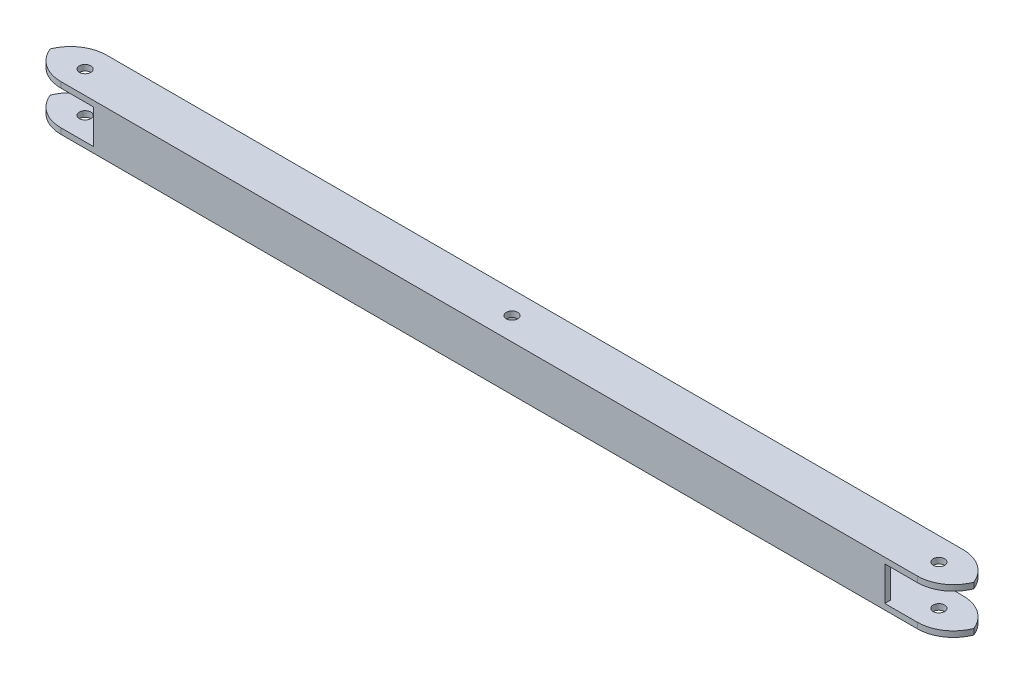
ISO-10303-21;
HEADER;
FILE_DESCRIPTION(('STEP AP214'),'2;1');
FILE_NAME('part.step','',(''),(''),'','','');
FILE_SCHEMA(('AUTOMOTIVE_DESIGN { 1 0 10303 214 1 1 1 1 }'));
ENDSEC;
DATA;
#1=APPLICATION_CONTEXT('core data for automotive mechanical design processes');
#2=APPLICATION_PROTOCOL_DEFINITION('international standard','automotive_design',2000,#1);
#3=PRODUCT_CONTEXT('',#1,'mechanical');
#4=PRODUCT('Part','Part','',(#3));
#5=PRODUCT_RELATED_PRODUCT_CATEGORY('part','',(#4));
#6=PRODUCT_DEFINITION_FORMATION('','',#4);
#7=PRODUCT_DEFINITION_CONTEXT('part definition',#1,'design');
#8=PRODUCT_DEFINITION('design','',#6,#7);
#9=PRODUCT_DEFINITION_SHAPE('','',#8);
#10=(LENGTH_UNIT() NAMED_UNIT(*) SI_UNIT(.MILLI.,.METRE.));
#11=(NAMED_UNIT(*) PLANE_ANGLE_UNIT() SI_UNIT($,.RADIAN.));
#12=(NAMED_UNIT(*) SI_UNIT($,.STERADIAN.) SOLID_ANGLE_UNIT());
#13=UNCERTAINTY_MEASURE_WITH_UNIT(LENGTH_MEASURE(1.E-05),#10,'distance_accuracy_value','');
#14=(GEOMETRIC_REPRESENTATION_CONTEXT(3) GLOBAL_UNCERTAINTY_ASSIGNED_CONTEXT((#13)) GLOBAL_UNIT_ASSIGNED_CONTEXT((#10,
#11,#12)) REPRESENTATION_CONTEXT('',''));
#15=CARTESIAN_POINT('',(0.,0.,0.));
#16=DIRECTION('',(0.,0.,1.));
#17=DIRECTION('',(1.,0.,0.));
#18=AXIS2_PLACEMENT_3D('',#15,#16,#17);
#19=CARTESIAN_POINT('',(515.5,25.4,25.4000000000002));
#20=DIRECTION('',(0.,0.,-1.));
#21=DIRECTION('',(-1.,0.,0.));
#22=AXIS2_PLACEMENT_3D('',#19,#20,#21);
#23=PLANE('',#22);
#24=DIRECTION('',(1.,0.,0.));
#25=VECTOR('',#24,1.);
#26=CARTESIAN_POINT('',(515.5,0.,25.4000000000002));
#27=LINE('',#26,#25);
#28=CARTESIAN_POINT('',(20.,0.,25.4000000000003));
#29=VERTEX_POINT('',#28);
#30=CARTESIAN_POINT('',(495.5,0.,25.4000000000002));
#31=VERTEX_POINT('',#30);
#32=EDGE_CURVE('E286',#29,#31,#27,.T.);
#33=ORIENTED_EDGE('',*,*,#32,.T.);
#34=DIRECTION('',(0.,-1.,0.));
#35=VECTOR('',#34,1.);
#36=CARTESIAN_POINT('',(495.5,25.4,25.4000000000002));
#37=LINE('',#36,#35);
#38=CARTESIAN_POINT('',(495.5,3.175,25.4000000000003));
#39=VERTEX_POINT('',#38);
#40=EDGE_CURVE('E11',#31,#39,#37,.F.);
#41=ORIENTED_EDGE('',*,*,#40,.T.);
#42=DIRECTION('',(1.,0.,0.));
#43=VECTOR('',#42,1.);
#44=CARTESIAN_POINT('',(477.4,3.175,25.4000000000003));
#45=LINE('',#44,#43);
#46=CARTESIAN_POINT('',(477.4,3.175,25.4000000000003));
#47=VERTEX_POINT('',#46);
#48=EDGE_CURVE('E190',#47,#39,#45,.T.);
#49=ORIENTED_EDGE('',*,*,#48,.F.);
#50=DIRECTION('',(0.,1.,0.));
#51=VECTOR('',#50,1.);
#52=CARTESIAN_POINT('',(477.4,22.225,25.4000000000003));
#53=LINE('',#52,#51);
#54=CARTESIAN_POINT('',(477.4,22.225,25.4000000000003));
#55=VERTEX_POINT('',#54);
#56=EDGE_CURVE('E196',#47,#55,#53,.T.);
#57=ORIENTED_EDGE('',*,*,#56,.T.);
#58=DIRECTION('',(1.,0.,0.));
#59=VECTOR('',#58,1.);
#60=CARTESIAN_POINT('',(477.4,22.225,25.4000000000003));
#61=LINE('',#60,#59);
#62=CARTESIAN_POINT('',(495.5,22.225,25.4000000000003));
#63=VERTEX_POINT('',#62);
#64=EDGE_CURVE('E178',#55,#63,#61,.T.);
#65=ORIENTED_EDGE('',*,*,#64,.T.);
#66=DIRECTION('',(0.,-1.,0.));
#67=VECTOR('',#66,1.);
#68=CARTESIAN_POINT('',(495.5,25.4,25.4000000000002));
#69=LINE('',#68,#67);
#70=CARTESIAN_POINT('',(495.5,25.4,25.4000000000002));
#71=VERTEX_POINT('',#70);
#72=EDGE_CURVE('E48',#63,#71,#69,.F.);
#73=ORIENTED_EDGE('',*,*,#72,.T.);
#74=DIRECTION('',(1.,0.,0.));
#75=VECTOR('',#74,1.);
#76=CARTESIAN_POINT('',(515.5,25.4,25.4000000000002));
#77=LINE('',#76,#75);
#78=CARTESIAN_POINT('',(20.,25.4,25.4000000000003));
#79=VERTEX_POINT('',#78);
#80=EDGE_CURVE('E289',#79,#71,#77,.T.);
#81=ORIENTED_EDGE('',*,*,#80,.F.);
#82=DIRECTION('',(0.,-1.,0.));
#83=VECTOR('',#82,1.);
#84=CARTESIAN_POINT('',(20.,25.4,25.4000000000003));
#85=LINE('',#84,#83);
#86=CARTESIAN_POINT('',(20.,22.225,25.4000000000003));
#87=VERTEX_POINT('',#86);
#88=EDGE_CURVE('E346',#79,#87,#85,.T.);
#89=ORIENTED_EDGE('',*,*,#88,.T.);
#90=DIRECTION('',(-1.,0.,0.));
#91=VECTOR('',#90,1.);
#92=CARTESIAN_POINT('',(38.1,22.225,25.4000000000003));
#93=LINE('',#92,#91);
#94=CARTESIAN_POINT('',(38.1,22.225,25.4000000000003));
#95=VERTEX_POINT('',#94);
#96=EDGE_CURVE('E234',#95,#87,#93,.T.);
#97=ORIENTED_EDGE('',*,*,#96,.F.);
#98=DIRECTION('',(0.,1.,0.));
#99=VECTOR('',#98,1.);
#100=CARTESIAN_POINT('',(38.1,22.225,25.4000000000003));
#101=LINE('',#100,#99);
#102=CARTESIAN_POINT('',(38.1,3.175,25.4000000000003));
#103=VERTEX_POINT('',#102);
#104=EDGE_CURVE('E230',#103,#95,#101,.T.);
#105=ORIENTED_EDGE('',*,*,#104,.F.);
#106=DIRECTION('',(-1.,0.,0.));
#107=VECTOR('',#106,1.);
#108=CARTESIAN_POINT('',(38.1,3.175,25.4000000000003));
#109=LINE('',#108,#107);
#110=CARTESIAN_POINT('',(20.,3.175,25.4000000000003));
#111=VERTEX_POINT('',#110);
#112=EDGE_CURVE('E238',#103,#111,#109,.T.);
#113=ORIENTED_EDGE('',*,*,#112,.T.);
#114=DIRECTION('',(0.,-1.,0.));
#115=VECTOR('',#114,1.);
#116=CARTESIAN_POINT('',(20.,25.4,25.4000000000003));
#117=LINE('',#116,#115);
#118=EDGE_CURVE('E349',#111,#29,#117,.T.);
#119=ORIENTED_EDGE('',*,*,#118,.T.);
#120=EDGE_LOOP('',(#33,#41,#49,#57,#65,#73,#81,#89,#97,#105,#113,#119));
#121=FACE_BOUND('',#120,.T.);
#122=ADVANCED_FACE('F39',(#121),#23,.F.);
#123=CARTESIAN_POINT('',(0.,25.4,0.));
#124=DIRECTION('',(0.,0.,1.));
#125=DIRECTION('',(1.,0.,0.));
#126=AXIS2_PLACEMENT_3D('',#123,#124,#125);
#127=PLANE('',#126);
#128=DIRECTION('',(1.,0.,0.));
#129=VECTOR('',#128,1.);
#130=CARTESIAN_POINT('',(477.4,3.175,0.));
#131=LINE('',#130,#129);
#132=CARTESIAN_POINT('',(477.4,3.175,0.));
#133=VERTEX_POINT('',#132);
#134=CARTESIAN_POINT('',(495.5,3.175,0.));
#135=VERTEX_POINT('',#134);
#136=EDGE_CURVE('E214',#133,#135,#131,.T.);
#137=ORIENTED_EDGE('',*,*,#136,.T.);
#138=DIRECTION('',(0.,-1.,0.));
#139=VECTOR('',#138,1.);
#140=CARTESIAN_POINT('',(495.5,25.4,0.));
#141=LINE('',#140,#139);
#142=CARTESIAN_POINT('',(495.5,0.,0.));
#143=VERTEX_POINT('',#142);
#144=EDGE_CURVE('E314',#135,#143,#141,.T.);
#145=ORIENTED_EDGE('',*,*,#144,.T.);
#146=DIRECTION('',(-1.,0.,0.));
#147=VECTOR('',#146,1.);
#148=CARTESIAN_POINT('',(0.,0.,0.));
#149=LINE('',#148,#147);
#150=CARTESIAN_POINT('',(20.,0.,0.));
#151=VERTEX_POINT('',#150);
#152=EDGE_CURVE('E292',#143,#151,#149,.T.);
#153=ORIENTED_EDGE('',*,*,#152,.T.);
#154=DIRECTION('',(0.,-1.,0.));
#155=VECTOR('',#154,1.);
#156=CARTESIAN_POINT('',(20.,25.4,0.));
#157=LINE('',#156,#155);
#158=CARTESIAN_POINT('',(20.,3.175,0.));
#159=VERTEX_POINT('',#158);
#160=EDGE_CURVE('E309',#151,#159,#157,.F.);
#161=ORIENTED_EDGE('',*,*,#160,.T.);
#162=DIRECTION('',(-1.,0.,0.));
#163=VECTOR('',#162,1.);
#164=CARTESIAN_POINT('',(38.1,3.175,0.));
#165=LINE('',#164,#163);
#166=CARTESIAN_POINT('',(38.1,3.175,0.));
#167=VERTEX_POINT('',#166);
#168=EDGE_CURVE('E241',#167,#159,#165,.T.);
#169=ORIENTED_EDGE('',*,*,#168,.F.);
#170=DIRECTION('',(0.,-1.,0.));
#171=VECTOR('',#170,1.);
#172=CARTESIAN_POINT('',(38.1,3.175,0.));
#173=LINE('',#172,#171);
#174=CARTESIAN_POINT('',(38.1,22.225,0.));
#175=VERTEX_POINT('',#174);
#176=EDGE_CURVE('E223',#175,#167,#173,.T.);
#177=ORIENTED_EDGE('',*,*,#176,.F.);
#178=DIRECTION('',(-1.,0.,0.));
#179=VECTOR('',#178,1.);
#180=CARTESIAN_POINT('',(38.1,22.225,0.));
#181=LINE('',#180,#179);
#182=CARTESIAN_POINT('',(20.,22.225,0.));
#183=VERTEX_POINT('',#182);
#184=EDGE_CURVE('E233',#175,#183,#181,.T.);
#185=ORIENTED_EDGE('',*,*,#184,.T.);
#186=DIRECTION('',(0.,-1.,0.));
#187=VECTOR('',#186,1.);
#188=CARTESIAN_POINT('',(20.,25.4,0.));
#189=LINE('',#188,#187);
#190=CARTESIAN_POINT('',(20.,25.4,0.));
#191=VERTEX_POINT('',#190);
#192=EDGE_CURVE('E307',#183,#191,#189,.F.);
#193=ORIENTED_EDGE('',*,*,#192,.T.);
#194=DIRECTION('',(-1.,0.,0.));
#195=VECTOR('',#194,1.);
#196=CARTESIAN_POINT('',(0.,25.4,0.));
#197=LINE('',#196,#195);
#198=CARTESIAN_POINT('',(495.5,25.4,0.));
#199=VERTEX_POINT('',#198);
#200=EDGE_CURVE('E291',#199,#191,#197,.T.);
#201=ORIENTED_EDGE('',*,*,#200,.F.);
#202=DIRECTION('',(0.,-1.,0.));
#203=VECTOR('',#202,1.);
#204=CARTESIAN_POINT('',(495.5,25.4,0.));
#205=LINE('',#204,#203);
#206=CARTESIAN_POINT('',(495.5,22.225,0.));
#207=VERTEX_POINT('',#206);
#208=EDGE_CURVE('E311',#199,#207,#205,.T.);
#209=ORIENTED_EDGE('',*,*,#208,.T.);
#210=DIRECTION('',(1.,0.,0.));
#211=VECTOR('',#210,1.);
#212=CARTESIAN_POINT('',(477.4,22.225,0.));
#213=LINE('',#212,#211);
#214=CARTESIAN_POINT('',(477.4,22.225,0.));
#215=VERTEX_POINT('',#214);
#216=EDGE_CURVE('E212',#215,#207,#213,.T.);
#217=ORIENTED_EDGE('',*,*,#216,.F.);
#218=DIRECTION('',(0.,-1.,0.));
#219=VECTOR('',#218,1.);
#220=CARTESIAN_POINT('',(477.4,3.175,0.));
#221=LINE('',#220,#219);
#222=EDGE_CURVE('E191',#215,#133,#221,.T.);
#223=ORIENTED_EDGE('',*,*,#222,.T.);
#224=EDGE_LOOP('',(#137,#145,#153,#161,#169,#177,#185,#193,#201,#209,#217,#223));
#225=FACE_BOUND('',#224,.T.);
#226=ADVANCED_FACE('F375',(#225),#127,.F.);
#227=CARTESIAN_POINT('',(257.75,25.4,12.7));
#228=DIRECTION('',(0.,-1.,0.));
#229=DIRECTION('',(0.,0.,-1.));
#230=AXIS2_PLACEMENT_3D('',#227,#228,#229);
#231=CYLINDRICAL_SURFACE('',#230,3.17499999999997);
#232=CARTESIAN_POINT('',(257.75,22.225,12.7));
#233=DIRECTION('',(0.,1.,0.));
#234=DIRECTION('',(0.,0.,1.));
#235=AXIS2_PLACEMENT_3D('',#232,#233,#234);
#236=CIRCLE('',#235,3.17499999999997);
#237=CARTESIAN_POINT('',(257.75,22.225,15.875));
#238=VERTEX_POINT('',#237);
#239=EDGE_CURVE('E267',#238,#238,#236,.T.);
#240=ORIENTED_EDGE('',*,*,#239,.F.);
#241=EDGE_LOOP('',(#240));
#242=FACE_BOUND('',#241,.T.);
#243=CARTESIAN_POINT('',(257.75,25.4,12.7));
#244=DIRECTION('',(0.,1.,0.));
#245=DIRECTION('',(0.,0.,1.));
#246=AXIS2_PLACEMENT_3D('',#243,#244,#245);
#247=CIRCLE('',#246,3.17499999999997);
#248=CARTESIAN_POINT('',(257.75,25.4,15.875));
#249=VERTEX_POINT('',#248);
#250=EDGE_CURVE('E283',#249,#249,#247,.T.);
#251=ORIENTED_EDGE('',*,*,#250,.T.);
#252=EDGE_LOOP('',(#251));
#253=FACE_BOUND('',#252,.T.);
#254=ADVANCED_FACE('F444',(#242,#253),#231,.F.);
#255=CARTESIAN_POINT('',(494.74,25.4,12.7));
#256=DIRECTION('',(0.,-1.,0.));
#257=DIRECTION('',(0.,0.,-1.));
#258=AXIS2_PLACEMENT_3D('',#255,#256,#257);
#259=CYLINDRICAL_SURFACE('',#258,3.17500000000009);
#260=CARTESIAN_POINT('',(494.74,22.225,12.7));
#261=DIRECTION('',(0.,1.,0.));
#262=DIRECTION('',(0.,0.,1.));
#263=AXIS2_PLACEMENT_3D('',#260,#261,#262);
#264=CIRCLE('',#263,3.17500000000009);
#265=CARTESIAN_POINT('',(494.74,22.225,15.8750000000001));
#266=VERTEX_POINT('',#265);
#267=EDGE_CURVE('E264',#266,#266,#264,.T.);
#268=ORIENTED_EDGE('',*,*,#267,.F.);
#269=EDGE_LOOP('',(#268));
#270=FACE_BOUND('',#269,.T.);
#271=CARTESIAN_POINT('',(494.74,25.4,12.7));
#272=DIRECTION('',(0.,1.,0.));
#273=DIRECTION('',(0.,0.,-1.));
#274=AXIS2_PLACEMENT_3D('',#271,#272,#273);
#275=CIRCLE('',#274,3.17500000000009);
#276=CARTESIAN_POINT('',(494.74,25.4,9.52499999999994));
#277=VERTEX_POINT('',#276);
#278=EDGE_CURVE('E277',#277,#277,#275,.T.);
#279=ORIENTED_EDGE('',*,*,#278,.T.);
#280=EDGE_LOOP('',(#279));
#281=FACE_BOUND('',#280,.T.);
#282=ADVANCED_FACE('F480',(#270,#281),#259,.F.);
#283=CARTESIAN_POINT('',(20.76,25.4,12.7000000000001));
#284=DIRECTION('',(0.,-1.,0.));
#285=DIRECTION('',(0.,0.,-1.));
#286=AXIS2_PLACEMENT_3D('',#283,#284,#285);
#287=CYLINDRICAL_SURFACE('',#286,3.175);
#288=CARTESIAN_POINT('',(20.76,22.225,12.7000000000001));
#289=DIRECTION('',(0.,1.,0.));
#290=DIRECTION('',(0.,0.,1.));
#291=AXIS2_PLACEMENT_3D('',#288,#289,#290);
#292=CIRCLE('',#291,3.175);
#293=CARTESIAN_POINT('',(20.76,22.225,15.8750000000001));
#294=VERTEX_POINT('',#293);
#295=EDGE_CURVE('E263',#294,#294,#292,.T.);
#296=ORIENTED_EDGE('',*,*,#295,.F.);
#297=EDGE_LOOP('',(#296));
#298=FACE_BOUND('',#297,.T.);
#299=CARTESIAN_POINT('',(20.76,25.4,12.7000000000001));
#300=DIRECTION('',(0.,1.,0.));
#301=DIRECTION('',(0.,0.,1.));
#302=AXIS2_PLACEMENT_3D('',#299,#300,#301);
#303=CIRCLE('',#302,3.175);
#304=CARTESIAN_POINT('',(20.76,25.4,15.8750000000001));
#305=VERTEX_POINT('',#304);
#306=EDGE_CURVE('E271',#305,#305,#303,.T.);
#307=ORIENTED_EDGE('',*,*,#306,.T.);
#308=EDGE_LOOP('',(#307));
#309=FACE_BOUND('',#308,.T.);
#310=ADVANCED_FACE('F475',(#298,#309),#287,.F.);
#311=CARTESIAN_POINT('',(0.,25.4,0.));
#312=DIRECTION('',(0.,-1.,0.));
#313=DIRECTION('',(0.,0.,-1.));
#314=AXIS2_PLACEMENT_3D('',#311,#312,#313);
#315=PLANE('',#314);
#316=CARTESIAN_POINT('',(495.5,25.4,5.40000000000022));
#317=DIRECTION('',(0.,-1.,0.));
#318=DIRECTION('',(0.,0.,-1.));
#319=AXIS2_PLACEMENT_3D('',#316,#317,#318);
#320=CIRCLE('',#319,20.);
#321=CARTESIAN_POINT('',(514.120150375333,25.4,12.7000000000001));
#322=VERTEX_POINT('',#321);
#323=EDGE_CURVE('E56',#71,#322,#320,.F.);
#324=ORIENTED_EDGE('',*,*,#323,.T.);
#325=CARTESIAN_POINT('',(495.5,25.4,19.9999999999999));
#326=DIRECTION('',(0.,-1.,0.));
#327=DIRECTION('',(0.,0.,-1.));
#328=AXIS2_PLACEMENT_3D('',#325,#326,#327);
#329=CIRCLE('',#328,20.);
#330=EDGE_CURVE('E344',#322,#199,#329,.F.);
#331=ORIENTED_EDGE('',*,*,#330,.T.);
#332=ORIENTED_EDGE('',*,*,#200,.T.);
#333=CARTESIAN_POINT('',(20.,25.4,20.));
#334=DIRECTION('',(0.,-1.,0.));
#335=DIRECTION('',(0.,0.,-1.));
#336=AXIS2_PLACEMENT_3D('',#333,#334,#335);
#337=CIRCLE('',#336,20.);
#338=CARTESIAN_POINT('',(1.37984962466732,25.4,12.7000000000001));
#339=VERTEX_POINT('',#338);
#340=EDGE_CURVE('E63',#191,#339,#337,.F.);
#341=ORIENTED_EDGE('',*,*,#340,.T.);
#342=CARTESIAN_POINT('',(20.,25.4,5.40000000000028));
#343=DIRECTION('',(0.,-1.,0.));
#344=DIRECTION('',(0.,0.,-1.));
#345=AXIS2_PLACEMENT_3D('',#342,#343,#344);
#346=CIRCLE('',#345,20.);
#347=EDGE_CURVE('E341',#339,#79,#346,.F.);
#348=ORIENTED_EDGE('',*,*,#347,.T.);
#349=ORIENTED_EDGE('',*,*,#80,.T.);
#350=EDGE_LOOP('',(#324,#331,#332,#341,#348,#349));
#351=FACE_BOUND('',#350,.T.);
#352=ORIENTED_EDGE('',*,*,#250,.F.);
#353=EDGE_LOOP('',(#352));
#354=FACE_BOUND('',#353,.T.);
#355=ORIENTED_EDGE('',*,*,#278,.F.);
#356=EDGE_LOOP('',(#355));
#357=FACE_BOUND('',#356,.T.);
#358=ORIENTED_EDGE('',*,*,#306,.F.);
#359=EDGE_LOOP('',(#358));
#360=FACE_BOUND('',#359,.T.);
#361=ADVANCED_FACE('F419',(#351,#354,#357,#360),#315,.F.);
#362=CARTESIAN_POINT('',(0.,0.,0.));
#363=DIRECTION('',(0.,-1.,0.));
#364=DIRECTION('',(0.,0.,-1.));
#365=AXIS2_PLACEMENT_3D('',#362,#363,#364);
#366=PLANE('',#365);
#367=CARTESIAN_POINT('',(494.74,0.,12.7));
#368=DIRECTION('',(0.,1.,0.));
#369=DIRECTION('',(0.,0.,-1.));
#370=AXIS2_PLACEMENT_3D('',#367,#368,#369);
#371=CIRCLE('',#370,3.17500000000009);
#372=CARTESIAN_POINT('',(494.74,0.,9.52499999999994));
#373=VERTEX_POINT('',#372);
#374=EDGE_CURVE('E274',#373,#373,#371,.T.);
#375=ORIENTED_EDGE('',*,*,#374,.T.);
#376=EDGE_LOOP('',(#375));
#377=FACE_BOUND('',#376,.T.);
#378=ORIENTED_EDGE('',*,*,#152,.F.);
#379=CARTESIAN_POINT('',(495.5,0.,19.9999999999999));
#380=DIRECTION('',(0.,-1.,0.));
#381=DIRECTION('',(0.,0.,-1.));
#382=AXIS2_PLACEMENT_3D('',#379,#380,#381);
#383=CIRCLE('',#382,20.);
#384=CARTESIAN_POINT('',(514.120150375333,0.,12.7000000000001));
#385=VERTEX_POINT('',#384);
#386=EDGE_CURVE('E323',#143,#385,#383,.T.);
#387=ORIENTED_EDGE('',*,*,#386,.T.);
#388=CARTESIAN_POINT('',(495.5,0.,5.40000000000022));
#389=DIRECTION('',(0.,-1.,0.));
#390=DIRECTION('',(0.,0.,-1.));
#391=AXIS2_PLACEMENT_3D('',#388,#389,#390);
#392=CIRCLE('',#391,20.);
#393=EDGE_CURVE('E321',#385,#31,#392,.T.);
#394=ORIENTED_EDGE('',*,*,#393,.T.);
#395=ORIENTED_EDGE('',*,*,#32,.F.);
#396=CARTESIAN_POINT('',(20.,0.,5.40000000000028));
#397=DIRECTION('',(0.,-1.,0.));
#398=DIRECTION('',(0.,0.,-1.));
#399=AXIS2_PLACEMENT_3D('',#396,#397,#398);
#400=CIRCLE('',#399,20.);
#401=CARTESIAN_POINT('',(1.37984962466732,0.,12.7000000000001));
#402=VERTEX_POINT('',#401);
#403=EDGE_CURVE('E319',#29,#402,#400,.T.);
#404=ORIENTED_EDGE('',*,*,#403,.T.);
#405=CARTESIAN_POINT('',(20.,0.,20.));
#406=DIRECTION('',(0.,-1.,0.));
#407=DIRECTION('',(0.,0.,-1.));
#408=AXIS2_PLACEMENT_3D('',#405,#406,#407);
#409=CIRCLE('',#408,20.);
#410=EDGE_CURVE('E317',#402,#151,#409,.T.);
#411=ORIENTED_EDGE('',*,*,#410,.T.);
#412=EDGE_LOOP('',(#378,#387,#394,#395,#404,#411));
#413=FACE_BOUND('',#412,.T.);
#414=CARTESIAN_POINT('',(257.75,0.,12.7));
#415=DIRECTION('',(0.,1.,0.));
#416=DIRECTION('',(0.,0.,1.));
#417=AXIS2_PLACEMENT_3D('',#414,#415,#416);
#418=CIRCLE('',#417,3.17499999999997);
#419=CARTESIAN_POINT('',(257.75,0.,15.875));
#420=VERTEX_POINT('',#419);
#421=EDGE_CURVE('E280',#420,#420,#418,.T.);
#422=ORIENTED_EDGE('',*,*,#421,.T.);
#423=EDGE_LOOP('',(#422));
#424=FACE_BOUND('',#423,.T.);
#425=CARTESIAN_POINT('',(20.76,0.,12.7000000000001));
#426=DIRECTION('',(0.,1.,0.));
#427=DIRECTION('',(0.,0.,1.));
#428=AXIS2_PLACEMENT_3D('',#425,#426,#427);
#429=CIRCLE('',#428,3.175);
#430=CARTESIAN_POINT('',(20.76,0.,15.8750000000001));
#431=VERTEX_POINT('',#430);
#432=EDGE_CURVE('E270',#431,#431,#429,.T.);
#433=ORIENTED_EDGE('',*,*,#432,.T.);
#434=EDGE_LOOP('',(#433));
#435=FACE_BOUND('',#434,.T.);
#436=ADVANCED_FACE('F401',(#377,#413,#424,#435),#366,.T.);
#437=CARTESIAN_POINT('',(257.75,3.175,12.7));
#438=DIRECTION('',(0.,-1.,0.));
#439=DIRECTION('',(0.,0.,-1.));
#440=AXIS2_PLACEMENT_3D('',#437,#438,#439);
#441=CIRCLE('',#440,3.17499999999997);
#442=CARTESIAN_POINT('',(257.75,3.175,9.52500000000003));
#443=VERTEX_POINT('',#442);
#444=EDGE_CURVE('E260',#443,#443,#441,.T.);
#445=ORIENTED_EDGE('',*,*,#444,.F.);
#446=EDGE_LOOP('',(#445));
#447=FACE_BOUND('',#446,.T.);
#448=ORIENTED_EDGE('',*,*,#421,.F.);
#449=EDGE_LOOP('',(#448));
#450=FACE_BOUND('',#449,.T.);
#451=ADVANCED_FACE('F478',(#447,#450),#231,.F.);
#452=CARTESIAN_POINT('',(494.74,3.175,12.7));
#453=DIRECTION('',(0.,-1.,0.));
#454=DIRECTION('',(0.,0.,-1.));
#455=AXIS2_PLACEMENT_3D('',#452,#453,#454);
#456=CIRCLE('',#455,3.17500000000009);
#457=CARTESIAN_POINT('',(494.74,3.175,9.52499999999994));
#458=VERTEX_POINT('',#457);
#459=EDGE_CURVE('E257',#458,#458,#456,.T.);
#460=ORIENTED_EDGE('',*,*,#459,.F.);
#461=EDGE_LOOP('',(#460));
#462=FACE_BOUND('',#461,.T.);
#463=ORIENTED_EDGE('',*,*,#374,.F.);
#464=EDGE_LOOP('',(#463));
#465=FACE_BOUND('',#464,.T.);
#466=ADVANCED_FACE('F473',(#462,#465),#259,.F.);
#467=CARTESIAN_POINT('',(20.76,3.175,12.7000000000001));
#468=DIRECTION('',(0.,-1.,0.));
#469=DIRECTION('',(0.,0.,-1.));
#470=AXIS2_PLACEMENT_3D('',#467,#468,#469);
#471=CIRCLE('',#470,3.175);
#472=CARTESIAN_POINT('',(20.76,3.175,9.52500000000007));
#473=VERTEX_POINT('',#472);
#474=EDGE_CURVE('E251',#473,#473,#471,.T.);
#475=ORIENTED_EDGE('',*,*,#474,.F.);
#476=EDGE_LOOP('',(#475));
#477=FACE_BOUND('',#476,.T.);
#478=ORIENTED_EDGE('',*,*,#432,.F.);
#479=EDGE_LOOP('',(#478));
#480=FACE_BOUND('',#479,.T.);
#481=ADVANCED_FACE('F469',(#477,#480),#287,.F.);
#482=CARTESIAN_POINT('',(542.440768363208,22.225,22.2250000000003));
#483=DIRECTION('',(0.,1.,0.));
#484=DIRECTION('',(0.,0.,1.));
#485=AXIS2_PLACEMENT_3D('',#482,#483,#484);
#486=PLANE('',#485);
#487=ORIENTED_EDGE('',*,*,#239,.T.);
#488=EDGE_LOOP('',(#487));
#489=FACE_BOUND('',#488,.T.);
#490=ORIENTED_EDGE('',*,*,#216,.T.);
#491=CARTESIAN_POINT('',(495.5,22.225,19.9999999999999));
#492=DIRECTION('',(0.,1.,0.));
#493=DIRECTION('',(0.,0.,1.));
#494=AXIS2_PLACEMENT_3D('',#491,#492,#493);
#495=CIRCLE('',#494,20.);
#496=CARTESIAN_POINT('',(514.120150375333,22.225,12.7000000000001));
#497=VERTEX_POINT('',#496);
#498=EDGE_CURVE('E338',#207,#497,#495,.F.);
#499=ORIENTED_EDGE('',*,*,#498,.T.);
#500=CARTESIAN_POINT('',(495.5,22.225,5.40000000000022));
#501=DIRECTION('',(0.,1.,0.));
#502=DIRECTION('',(0.,0.,1.));
#503=AXIS2_PLACEMENT_3D('',#500,#501,#502);
#504=CIRCLE('',#503,20.);
#505=EDGE_CURVE('E186',#497,#63,#504,.F.);
#506=ORIENTED_EDGE('',*,*,#505,.T.);
#507=ORIENTED_EDGE('',*,*,#64,.F.);
#508=DIRECTION('',(0.,0.,-1.));
#509=VECTOR('',#508,1.);
#510=CARTESIAN_POINT('',(477.4,22.225,0.));
#511=LINE('',#510,#509);
#512=CARTESIAN_POINT('',(477.4,22.225,22.2250000000003));
#513=VERTEX_POINT('',#512);
#514=EDGE_CURVE('E183',#55,#513,#511,.T.);
#515=ORIENTED_EDGE('',*,*,#514,.T.);
#516=DIRECTION('',(-1.,0.,0.));
#517=VECTOR('',#516,1.);
#518=CARTESIAN_POINT('',(542.440768363208,22.225,22.2250000000003));
#519=LINE('',#518,#517);
#520=CARTESIAN_POINT('',(38.1,22.225,22.2250000000003));
#521=VERTEX_POINT('',#520);
#522=EDGE_CURVE('E249',#513,#521,#519,.T.);
#523=ORIENTED_EDGE('',*,*,#522,.T.);
#524=DIRECTION('',(0.,0.,-1.));
#525=VECTOR('',#524,1.);
#526=CARTESIAN_POINT('',(38.1,22.225,0.));
#527=LINE('',#526,#525);
#528=EDGE_CURVE('E220',#95,#521,#527,.T.);
#529=ORIENTED_EDGE('',*,*,#528,.F.);
#530=ORIENTED_EDGE('',*,*,#96,.T.);
#531=CARTESIAN_POINT('',(20.,22.225,5.40000000000028));
#532=DIRECTION('',(0.,1.,0.));
#533=DIRECTION('',(0.,0.,1.));
#534=AXIS2_PLACEMENT_3D('',#531,#532,#533);
#535=CIRCLE('',#534,20.);
#536=CARTESIAN_POINT('',(1.37984962466732,22.225,12.7000000000001));
#537=VERTEX_POINT('',#536);
#538=EDGE_CURVE('E335',#87,#537,#535,.F.);
#539=ORIENTED_EDGE('',*,*,#538,.T.);
#540=CARTESIAN_POINT('',(20.,22.225,20.));
#541=DIRECTION('',(0.,1.,0.));
#542=DIRECTION('',(0.,0.,1.));
#543=AXIS2_PLACEMENT_3D('',#540,#541,#542);
#544=CIRCLE('',#543,20.);
#545=EDGE_CURVE('E333',#537,#183,#544,.F.);
#546=ORIENTED_EDGE('',*,*,#545,.T.);
#547=ORIENTED_EDGE('',*,*,#184,.F.);
#548=CARTESIAN_POINT('',(38.1,22.225,3.175));
#549=VERTEX_POINT('',#548);
#550=EDGE_CURVE('E219',#549,#175,#527,.T.);
#551=ORIENTED_EDGE('',*,*,#550,.F.);
#552=DIRECTION('',(-1.,0.,0.));
#553=VECTOR('',#552,1.);
#554=CARTESIAN_POINT('',(542.440768363208,22.225,3.175));
#555=LINE('',#554,#553);
#556=CARTESIAN_POINT('',(477.4,22.225,3.175));
#557=VERTEX_POINT('',#556);
#558=EDGE_CURVE('E248',#557,#549,#555,.T.);
#559=ORIENTED_EDGE('',*,*,#558,.F.);
#560=EDGE_CURVE('E200',#557,#215,#511,.T.);
#561=ORIENTED_EDGE('',*,*,#560,.T.);
#562=EDGE_LOOP('',(#490,#499,#506,#507,#515,#523,#529,#530,#539,#546,#547,#551,#559,#561));
#563=FACE_BOUND('',#562,.T.);
#564=ORIENTED_EDGE('',*,*,#295,.T.);
#565=EDGE_LOOP('',(#564));
#566=FACE_BOUND('',#565,.T.);
#567=ORIENTED_EDGE('',*,*,#267,.T.);
#568=EDGE_LOOP('',(#567));
#569=FACE_BOUND('',#568,.T.);
#570=ADVANCED_FACE('F181',(#489,#563,#566,#569),#486,.F.);
#571=CARTESIAN_POINT('',(542.440768363208,3.175,22.2250000000003));
#572=DIRECTION('',(0.,0.,1.));
#573=DIRECTION('',(1.,0.,0.));
#574=AXIS2_PLACEMENT_3D('',#571,#572,#573);
#575=PLANE('',#574);
#576=ORIENTED_EDGE('',*,*,#522,.F.);
#577=DIRECTION('',(0.,-1.,0.));
#578=VECTOR('',#577,1.);
#579=CARTESIAN_POINT('',(477.4,3.175,22.2250000000003));
#580=LINE('',#579,#578);
#581=CARTESIAN_POINT('',(477.4,3.175,22.2250000000003));
#582=VERTEX_POINT('',#581);
#583=EDGE_CURVE('E199',#513,#582,#580,.T.);
#584=ORIENTED_EDGE('',*,*,#583,.T.);
#585=DIRECTION('',(-1.,0.,0.));
#586=VECTOR('',#585,1.);
#587=CARTESIAN_POINT('',(542.440768363208,3.175,22.2250000000003));
#588=LINE('',#587,#586);
#589=CARTESIAN_POINT('',(38.1,3.175,22.2250000000003));
#590=VERTEX_POINT('',#589);
#591=EDGE_CURVE('E252',#582,#590,#588,.T.);
#592=ORIENTED_EDGE('',*,*,#591,.T.);
#593=DIRECTION('',(0.,1.,0.));
#594=VECTOR('',#593,1.);
#595=CARTESIAN_POINT('',(38.1,3.175,22.2250000000003));
#596=LINE('',#595,#594);
#597=EDGE_CURVE('E237',#590,#521,#596,.T.);
#598=ORIENTED_EDGE('',*,*,#597,.T.);
#599=EDGE_LOOP('',(#576,#584,#592,#598));
#600=FACE_BOUND('',#599,.T.);
#601=ADVANCED_FACE('F411',(#600),#575,.F.);
#602=CARTESIAN_POINT('',(542.440768363208,3.175,3.175));
#603=DIRECTION('',(0.,-1.,0.));
#604=DIRECTION('',(0.,0.,-1.));
#605=AXIS2_PLACEMENT_3D('',#602,#603,#604);
#606=PLANE('',#605);
#607=ORIENTED_EDGE('',*,*,#444,.T.);
#608=EDGE_LOOP('',(#607));
#609=FACE_BOUND('',#608,.T.);
#610=CARTESIAN_POINT('',(495.5,3.175,5.40000000000022));
#611=DIRECTION('',(0.,-1.,0.));
#612=DIRECTION('',(0.,0.,-1.));
#613=AXIS2_PLACEMENT_3D('',#610,#611,#612);
#614=CIRCLE('',#613,20.);
#615=CARTESIAN_POINT('',(514.120150375333,3.175,12.7000000000001));
#616=VERTEX_POINT('',#615);
#617=EDGE_CURVE('E329',#39,#616,#614,.F.);
#618=ORIENTED_EDGE('',*,*,#617,.T.);
#619=CARTESIAN_POINT('',(495.5,3.175,19.9999999999999));
#620=DIRECTION('',(0.,-1.,0.));
#621=DIRECTION('',(0.,0.,-1.));
#622=AXIS2_PLACEMENT_3D('',#619,#620,#621);
#623=CIRCLE('',#622,20.);
#624=EDGE_CURVE('E331',#616,#135,#623,.F.);
#625=ORIENTED_EDGE('',*,*,#624,.T.);
#626=ORIENTED_EDGE('',*,*,#136,.F.);
#627=DIRECTION('',(0.,0.,1.));
#628=VECTOR('',#627,1.);
#629=CARTESIAN_POINT('',(477.4,3.175,25.4000000000003));
#630=LINE('',#629,#628);
#631=CARTESIAN_POINT('',(477.4,3.175,3.175));
#632=VERTEX_POINT('',#631);
#633=EDGE_CURVE('E206',#133,#632,#630,.T.);
#634=ORIENTED_EDGE('',*,*,#633,.T.);
#635=DIRECTION('',(-1.,0.,0.));
#636=VECTOR('',#635,1.);
#637=CARTESIAN_POINT('',(542.440768363208,3.175,3.175));
#638=LINE('',#637,#636);
#639=CARTESIAN_POINT('',(38.1,3.175,3.175));
#640=VERTEX_POINT('',#639);
#641=EDGE_CURVE('E254',#632,#640,#638,.T.);
#642=ORIENTED_EDGE('',*,*,#641,.T.);
#643=DIRECTION('',(0.,0.,1.));
#644=VECTOR('',#643,1.);
#645=CARTESIAN_POINT('',(38.1,3.175,25.4000000000003));
#646=LINE('',#645,#644);
#647=EDGE_CURVE('E227',#167,#640,#646,.T.);
#648=ORIENTED_EDGE('',*,*,#647,.F.);
#649=ORIENTED_EDGE('',*,*,#168,.T.);
#650=CARTESIAN_POINT('',(20.,3.175,20.));
#651=DIRECTION('',(0.,-1.,0.));
#652=DIRECTION('',(0.,0.,-1.));
#653=AXIS2_PLACEMENT_3D('',#650,#651,#652);
#654=CIRCLE('',#653,20.);
#655=CARTESIAN_POINT('',(1.37984962466732,3.175,12.7000000000001));
#656=VERTEX_POINT('',#655);
#657=EDGE_CURVE('E325',#159,#656,#654,.F.);
#658=ORIENTED_EDGE('',*,*,#657,.T.);
#659=CARTESIAN_POINT('',(20.,3.175,5.40000000000028));
#660=DIRECTION('',(0.,-1.,0.));
#661=DIRECTION('',(0.,0.,-1.));
#662=AXIS2_PLACEMENT_3D('',#659,#660,#661);
#663=CIRCLE('',#662,20.);
#664=EDGE_CURVE('E327',#656,#111,#663,.F.);
#665=ORIENTED_EDGE('',*,*,#664,.T.);
#666=ORIENTED_EDGE('',*,*,#112,.F.);
#667=EDGE_CURVE('E226',#590,#103,#646,.T.);
#668=ORIENTED_EDGE('',*,*,#667,.F.);
#669=ORIENTED_EDGE('',*,*,#591,.F.);
#670=EDGE_CURVE('E204',#582,#47,#630,.T.);
#671=ORIENTED_EDGE('',*,*,#670,.T.);
#672=ORIENTED_EDGE('',*,*,#48,.T.);
#673=EDGE_LOOP('',(#618,#625,#626,#634,#642,#648,#649,#658,#665,#666,#668,#669,#671,#672));
#674=FACE_BOUND('',#673,.T.);
#675=ORIENTED_EDGE('',*,*,#474,.T.);
#676=EDGE_LOOP('',(#675));
#677=FACE_BOUND('',#676,.T.);
#678=ORIENTED_EDGE('',*,*,#459,.T.);
#679=EDGE_LOOP('',(#678));
#680=FACE_BOUND('',#679,.T.);
#681=ADVANCED_FACE('F390',(#609,#674,#677,#680),#606,.F.);
#682=CARTESIAN_POINT('',(542.440768363208,22.225,3.175));
#683=DIRECTION('',(0.,0.,-1.));
#684=DIRECTION('',(-1.,0.,0.));
#685=AXIS2_PLACEMENT_3D('',#682,#683,#684);
#686=PLANE('',#685);
#687=ORIENTED_EDGE('',*,*,#641,.F.);
#688=DIRECTION('',(0.,1.,0.));
#689=VECTOR('',#688,1.);
#690=CARTESIAN_POINT('',(477.4,22.225,3.175));
#691=LINE('',#690,#689);
#692=EDGE_CURVE('E304',#632,#557,#691,.T.);
#693=ORIENTED_EDGE('',*,*,#692,.T.);
#694=ORIENTED_EDGE('',*,*,#558,.T.);
#695=DIRECTION('',(0.,-1.,0.));
#696=VECTOR('',#695,1.);
#697=CARTESIAN_POINT('',(38.1,22.225,3.175));
#698=LINE('',#697,#696);
#699=EDGE_CURVE('E294',#549,#640,#698,.T.);
#700=ORIENTED_EDGE('',*,*,#699,.T.);
#701=EDGE_LOOP('',(#687,#693,#694,#700));
#702=FACE_BOUND('',#701,.T.);
#703=ADVANCED_FACE('F385',(#702),#686,.F.);
#704=CARTESIAN_POINT('',(38.1,0.,0.));
#705=DIRECTION('',(1.,0.,0.));
#706=DIRECTION('',(0.,0.,-1.));
#707=AXIS2_PLACEMENT_3D('',#704,#705,#706);
#708=PLANE('',#707);
#709=ORIENTED_EDGE('',*,*,#550,.T.);
#710=ORIENTED_EDGE('',*,*,#176,.T.);
#711=ORIENTED_EDGE('',*,*,#647,.T.);
#712=ORIENTED_EDGE('',*,*,#699,.F.);
#713=EDGE_LOOP('',(#709,#710,#711,#712));
#714=FACE_BOUND('',#713,.T.);
#715=ADVANCED_FACE('F379',(#714),#708,.F.);
#716=ORIENTED_EDGE('',*,*,#667,.T.);
#717=ORIENTED_EDGE('',*,*,#104,.T.);
#718=ORIENTED_EDGE('',*,*,#528,.T.);
#719=ORIENTED_EDGE('',*,*,#597,.F.);
#720=EDGE_LOOP('',(#716,#717,#718,#719));
#721=FACE_BOUND('',#720,.T.);
#722=ADVANCED_FACE('F414',(#721),#708,.F.);
#723=CARTESIAN_POINT('',(477.4,0.,0.));
#724=DIRECTION('',(-1.,0.,0.));
#725=DIRECTION('',(0.,0.,-1.));
#726=AXIS2_PLACEMENT_3D('',#723,#724,#725);
#727=PLANE('',#726);
#728=ORIENTED_EDGE('',*,*,#633,.F.);
#729=ORIENTED_EDGE('',*,*,#222,.F.);
#730=ORIENTED_EDGE('',*,*,#560,.F.);
#731=ORIENTED_EDGE('',*,*,#692,.F.);
#732=EDGE_LOOP('',(#728,#729,#730,#731));
#733=FACE_BOUND('',#732,.T.);
#734=ADVANCED_FACE('F388',(#733),#727,.F.);
#735=ORIENTED_EDGE('',*,*,#514,.F.);
#736=ORIENTED_EDGE('',*,*,#56,.F.);
#737=ORIENTED_EDGE('',*,*,#670,.F.);
#738=ORIENTED_EDGE('',*,*,#583,.F.);
#739=EDGE_LOOP('',(#735,#736,#737,#738));
#740=FACE_BOUND('',#739,.T.);
#741=ADVANCED_FACE('F195',(#740),#727,.F.);
#742=CARTESIAN_POINT('',(495.5,25.4,5.40000000000022));
#743=DIRECTION('',(0.,-1.,0.));
#744=DIRECTION('',(0.,0.,-1.));
#745=AXIS2_PLACEMENT_3D('',#742,#743,#744);
#746=CYLINDRICAL_SURFACE('',#745,20.);
#747=DIRECTION('',(0.,-1.,0.));
#748=VECTOR('',#747,1.);
#749=CARTESIAN_POINT('',(514.120150375333,1.5875,12.7000000000001));
#750=LINE('',#749,#748);
#751=EDGE_CURVE('E353',#616,#385,#750,.T.);
#752=ORIENTED_EDGE('',*,*,#751,.F.);
#753=ORIENTED_EDGE('',*,*,#617,.F.);
#754=ORIENTED_EDGE('',*,*,#40,.F.);
#755=ORIENTED_EDGE('',*,*,#393,.F.);
#756=EDGE_LOOP('',(#752,#753,#754,#755));
#757=FACE_BOUND('',#756,.T.);
#758=ADVANCED_FACE('F406',(#757),#746,.T.);
#759=CARTESIAN_POINT('',(495.5,25.4,19.9999999999999));
#760=DIRECTION('',(0.,-1.,0.));
#761=DIRECTION('',(0.,0.,-1.));
#762=AXIS2_PLACEMENT_3D('',#759,#760,#761);
#763=CYLINDRICAL_SURFACE('',#762,20.);
#764=ORIENTED_EDGE('',*,*,#624,.F.);
#765=ORIENTED_EDGE('',*,*,#751,.T.);
#766=ORIENTED_EDGE('',*,*,#386,.F.);
#767=ORIENTED_EDGE('',*,*,#144,.F.);
#768=EDGE_LOOP('',(#764,#765,#766,#767));
#769=FACE_BOUND('',#768,.T.);
#770=ADVANCED_FACE('F397',(#769),#763,.T.);
#771=CARTESIAN_POINT('',(495.5,25.4,5.40000000000022));
#772=DIRECTION('',(0.,-1.,0.));
#773=DIRECTION('',(0.,0.,-1.));
#774=AXIS2_PLACEMENT_3D('',#771,#772,#773);
#775=CYLINDRICAL_SURFACE('',#774,20.);
#776=DIRECTION('',(0.,-1.,0.));
#777=VECTOR('',#776,1.);
#778=CARTESIAN_POINT('',(514.120150375333,23.8125,12.7000000000001));
#779=LINE('',#778,#777);
#780=EDGE_CURVE('E356',#322,#497,#779,.T.);
#781=ORIENTED_EDGE('',*,*,#780,.F.);
#782=ORIENTED_EDGE('',*,*,#323,.F.);
#783=ORIENTED_EDGE('',*,*,#72,.F.);
#784=ORIENTED_EDGE('',*,*,#505,.F.);
#785=EDGE_LOOP('',(#781,#782,#783,#784));
#786=FACE_BOUND('',#785,.T.);
#787=ADVANCED_FACE('F422',(#786),#775,.T.);
#788=CARTESIAN_POINT('',(495.5,25.4,19.9999999999999));
#789=DIRECTION('',(0.,-1.,0.));
#790=DIRECTION('',(0.,0.,-1.));
#791=AXIS2_PLACEMENT_3D('',#788,#789,#790);
#792=CYLINDRICAL_SURFACE('',#791,20.);
#793=ORIENTED_EDGE('',*,*,#330,.F.);
#794=ORIENTED_EDGE('',*,*,#780,.T.);
#795=ORIENTED_EDGE('',*,*,#498,.F.);
#796=ORIENTED_EDGE('',*,*,#208,.F.);
#797=EDGE_LOOP('',(#793,#794,#795,#796));
#798=FACE_BOUND('',#797,.T.);
#799=ADVANCED_FACE('F426',(#798),#792,.T.);
#800=CARTESIAN_POINT('',(20.,25.4,20.));
#801=DIRECTION('',(0.,-1.,0.));
#802=DIRECTION('',(0.,0.,-1.));
#803=AXIS2_PLACEMENT_3D('',#800,#801,#802);
#804=CYLINDRICAL_SURFACE('',#803,20.);
#805=DIRECTION('',(0.,-1.,0.));
#806=VECTOR('',#805,1.);
#807=CARTESIAN_POINT('',(1.37984962466732,1.5875,12.7000000000001));
#808=LINE('',#807,#806);
#809=EDGE_CURVE('E358',#656,#402,#808,.T.);
#810=ORIENTED_EDGE('',*,*,#809,.F.);
#811=ORIENTED_EDGE('',*,*,#657,.F.);
#812=ORIENTED_EDGE('',*,*,#160,.F.);
#813=ORIENTED_EDGE('',*,*,#410,.F.);
#814=EDGE_LOOP('',(#810,#811,#812,#813));
#815=FACE_BOUND('',#814,.T.);
#816=ADVANCED_FACE('F428',(#815),#804,.T.);
#817=CARTESIAN_POINT('',(20.,25.4,5.40000000000028));
#818=DIRECTION('',(0.,-1.,0.));
#819=DIRECTION('',(0.,0.,-1.));
#820=AXIS2_PLACEMENT_3D('',#817,#818,#819);
#821=CYLINDRICAL_SURFACE('',#820,20.);
#822=ORIENTED_EDGE('',*,*,#664,.F.);
#823=ORIENTED_EDGE('',*,*,#809,.T.);
#824=ORIENTED_EDGE('',*,*,#403,.F.);
#825=ORIENTED_EDGE('',*,*,#118,.F.);
#826=EDGE_LOOP('',(#822,#823,#824,#825));
#827=FACE_BOUND('',#826,.T.);
#828=ADVANCED_FACE('F434',(#827),#821,.T.);
#829=CARTESIAN_POINT('',(20.,25.4,20.));
#830=DIRECTION('',(0.,-1.,0.));
#831=DIRECTION('',(0.,0.,-1.));
#832=AXIS2_PLACEMENT_3D('',#829,#830,#831);
#833=CYLINDRICAL_SURFACE('',#832,20.);
#834=DIRECTION('',(0.,-1.,0.));
#835=VECTOR('',#834,1.);
#836=CARTESIAN_POINT('',(1.37984962466732,23.8125,12.7000000000001));
#837=LINE('',#836,#835);
#838=EDGE_CURVE('E43',#339,#537,#837,.T.);
#839=ORIENTED_EDGE('',*,*,#838,.F.);
#840=ORIENTED_EDGE('',*,*,#340,.F.);
#841=ORIENTED_EDGE('',*,*,#192,.F.);
#842=ORIENTED_EDGE('',*,*,#545,.F.);
#843=EDGE_LOOP('',(#839,#840,#841,#842));
#844=FACE_BOUND('',#843,.T.);
#845=ADVANCED_FACE('F41',(#844),#833,.T.);
#846=CARTESIAN_POINT('',(20.,25.4,5.40000000000028));
#847=DIRECTION('',(0.,-1.,0.));
#848=DIRECTION('',(0.,0.,-1.));
#849=AXIS2_PLACEMENT_3D('',#846,#847,#848);
#850=CYLINDRICAL_SURFACE('',#849,20.);
#851=ORIENTED_EDGE('',*,*,#347,.F.);
#852=ORIENTED_EDGE('',*,*,#838,.T.);
#853=ORIENTED_EDGE('',*,*,#538,.F.);
#854=ORIENTED_EDGE('',*,*,#88,.F.);
#855=EDGE_LOOP('',(#851,#852,#853,#854));
#856=FACE_BOUND('',#855,.T.);
#857=ADVANCED_FACE('F366',(#856),#850,.T.);
#858=CLOSED_SHELL('',(#122,#226,#254,#282,#310,#361,#436,#451,#466,#481,#570,#601,#681,#703,
#715,#722,#734,#741,#758,#770,#787,#799,#816,#828,#845,#857));
#859=MANIFOLD_SOLID_BREP('B2',#858);
#860=ADVANCED_BREP_SHAPE_REPRESENTATION('',(#18,#859),#14);
#861=SHAPE_DEFINITION_REPRESENTATION(#9,#860);
ENDSEC;
END-ISO-10303-21;
